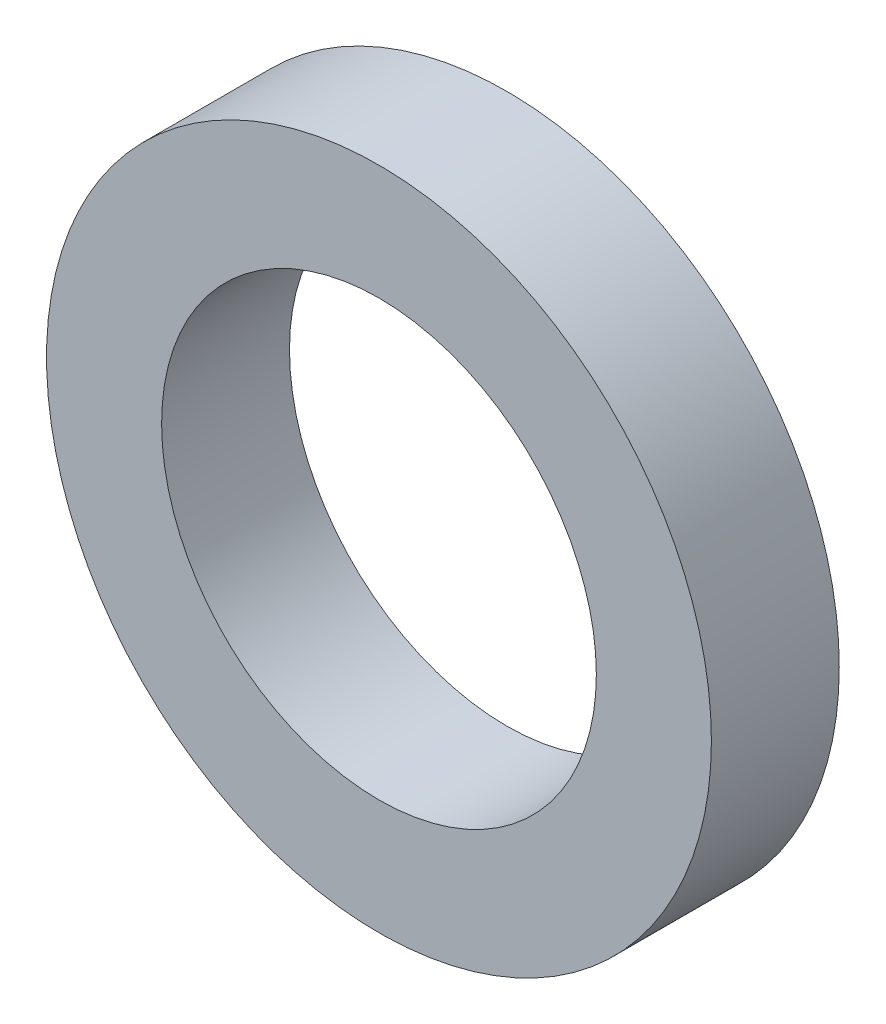
ISO-10303-21;
HEADER;
FILE_DESCRIPTION(('STEP AP214'),'2;1');
FILE_NAME('part.step','',(''),(''),'','','');
FILE_SCHEMA(('AUTOMOTIVE_DESIGN { 1 0 10303 214 1 1 1 1 }'));
ENDSEC;
DATA;
#1=APPLICATION_CONTEXT('core data for automotive mechanical design processes');
#2=APPLICATION_PROTOCOL_DEFINITION('international standard','automotive_design',2000,#1);
#3=PRODUCT_CONTEXT('',#1,'mechanical');
#4=PRODUCT('Part','Part','',(#3));
#5=PRODUCT_RELATED_PRODUCT_CATEGORY('part','',(#4));
#6=PRODUCT_DEFINITION_FORMATION('','',#4);
#7=PRODUCT_DEFINITION_CONTEXT('part definition',#1,'design');
#8=PRODUCT_DEFINITION('design','',#6,#7);
#9=PRODUCT_DEFINITION_SHAPE('','',#8);
#10=(LENGTH_UNIT() NAMED_UNIT(*) SI_UNIT(.MILLI.,.METRE.));
#11=(NAMED_UNIT(*) PLANE_ANGLE_UNIT() SI_UNIT($,.RADIAN.));
#12=(NAMED_UNIT(*) SI_UNIT($,.STERADIAN.) SOLID_ANGLE_UNIT());
#13=UNCERTAINTY_MEASURE_WITH_UNIT(LENGTH_MEASURE(1.E-05),#10,'distance_accuracy_value','');
#14=(GEOMETRIC_REPRESENTATION_CONTEXT(3) GLOBAL_UNCERTAINTY_ASSIGNED_CONTEXT((#13)) GLOBAL_UNIT_ASSIGNED_CONTEXT((#10,
#11,#12)) REPRESENTATION_CONTEXT('',''));
#15=CARTESIAN_POINT('',(0.,0.,0.));
#16=DIRECTION('',(0.,0.,1.));
#17=DIRECTION('',(1.,0.,0.));
#18=AXIS2_PLACEMENT_3D('',#15,#16,#17);
#19=CARTESIAN_POINT('',(0.,0.,-15.));
#20=DIRECTION('',(0.,0.,1.));
#21=DIRECTION('',(1.,0.,0.));
#22=AXIS2_PLACEMENT_3D('',#19,#20,#21);
#23=PLANE('',#22);
#24=CARTESIAN_POINT('',(0.,0.,-15.));
#25=DIRECTION('',(0.,0.,1.));
#26=DIRECTION('',(1.,0.,0.));
#27=AXIS2_PLACEMENT_3D('',#24,#25,#26);
#28=CIRCLE('',#27,13.);
#29=CARTESIAN_POINT('',(13.,0.,-15.));
#30=VERTEX_POINT('',#29);
#31=EDGE_CURVE('E10',#30,#30,#28,.T.);
#32=ORIENTED_EDGE('',*,*,#31,.T.);
#33=EDGE_LOOP('',(#32));
#34=FACE_BOUND('',#33,.T.);
#35=CARTESIAN_POINT('',(0.,0.,-15.));
#36=DIRECTION('',(0.,0.,1.));
#37=DIRECTION('',(1.,0.,0.));
#38=AXIS2_PLACEMENT_3D('',#35,#36,#37);
#39=CIRCLE('',#38,8.5);
#40=CARTESIAN_POINT('',(8.5,0.,-15.));
#41=VERTEX_POINT('',#40);
#42=EDGE_CURVE('E46',#41,#41,#39,.T.);
#43=ORIENTED_EDGE('',*,*,#42,.F.);
#44=EDGE_LOOP('',(#43));
#45=FACE_BOUND('',#44,.T.);
#46=ADVANCED_FACE('F32',(#34,#45),#23,.T.);
#47=CARTESIAN_POINT('',(0.,0.,-20.));
#48=DIRECTION('',(0.,0.,1.));
#49=DIRECTION('',(1.,0.,0.));
#50=AXIS2_PLACEMENT_3D('',#47,#48,#49);
#51=PLANE('',#50);
#52=CARTESIAN_POINT('',(0.,0.,-20.));
#53=DIRECTION('',(0.,0.,1.));
#54=DIRECTION('',(1.,0.,0.));
#55=AXIS2_PLACEMENT_3D('',#52,#53,#54);
#56=CIRCLE('',#55,13.);
#57=CARTESIAN_POINT('',(13.,0.,-20.));
#58=VERTEX_POINT('',#57);
#59=EDGE_CURVE('E36',#58,#58,#56,.T.);
#60=ORIENTED_EDGE('',*,*,#59,.F.);
#61=EDGE_LOOP('',(#60));
#62=FACE_BOUND('',#61,.T.);
#63=CARTESIAN_POINT('',(0.,0.,-20.));
#64=DIRECTION('',(0.,0.,1.));
#65=DIRECTION('',(1.,0.,0.));
#66=AXIS2_PLACEMENT_3D('',#63,#64,#65);
#67=CIRCLE('',#66,8.5);
#68=CARTESIAN_POINT('',(8.5,0.,-20.));
#69=VERTEX_POINT('',#68);
#70=EDGE_CURVE('E48',#69,#69,#67,.T.);
#71=ORIENTED_EDGE('',*,*,#70,.T.);
#72=EDGE_LOOP('',(#71));
#73=FACE_BOUND('',#72,.T.);
#74=ADVANCED_FACE('F59',(#62,#73),#51,.F.);
#75=CARTESIAN_POINT('',(0.,0.,-15.));
#76=DIRECTION('',(0.,0.,-1.));
#77=DIRECTION('',(-1.,0.,0.));
#78=AXIS2_PLACEMENT_3D('',#75,#76,#77);
#79=CYLINDRICAL_SURFACE('',#78,13.);
#80=ORIENTED_EDGE('',*,*,#31,.F.);
#81=EDGE_LOOP('',(#80));
#82=FACE_BOUND('',#81,.T.);
#83=ORIENTED_EDGE('',*,*,#59,.T.);
#84=EDGE_LOOP('',(#83));
#85=FACE_BOUND('',#84,.T.);
#86=ADVANCED_FACE('F34',(#82,#85),#79,.T.);
#87=CARTESIAN_POINT('',(0.,0.,-15.));
#88=DIRECTION('',(0.,0.,-1.));
#89=DIRECTION('',(-1.,0.,0.));
#90=AXIS2_PLACEMENT_3D('',#87,#88,#89);
#91=CYLINDRICAL_SURFACE('',#90,8.5);
#92=ORIENTED_EDGE('',*,*,#42,.T.);
#93=EDGE_LOOP('',(#92));
#94=FACE_BOUND('',#93,.T.);
#95=ORIENTED_EDGE('',*,*,#70,.F.);
#96=EDGE_LOOP('',(#95));
#97=FACE_BOUND('',#96,.T.);
#98=ADVANCED_FACE('F55',(#94,#97),#91,.F.);
#99=CLOSED_SHELL('',(#46,#74,#86,#98));
#100=MANIFOLD_SOLID_BREP('B2',#99);
#101=ADVANCED_BREP_SHAPE_REPRESENTATION('',(#18,#100),#14);
#102=SHAPE_DEFINITION_REPRESENTATION(#9,#101);
ENDSEC;
END-ISO-10303-21;
